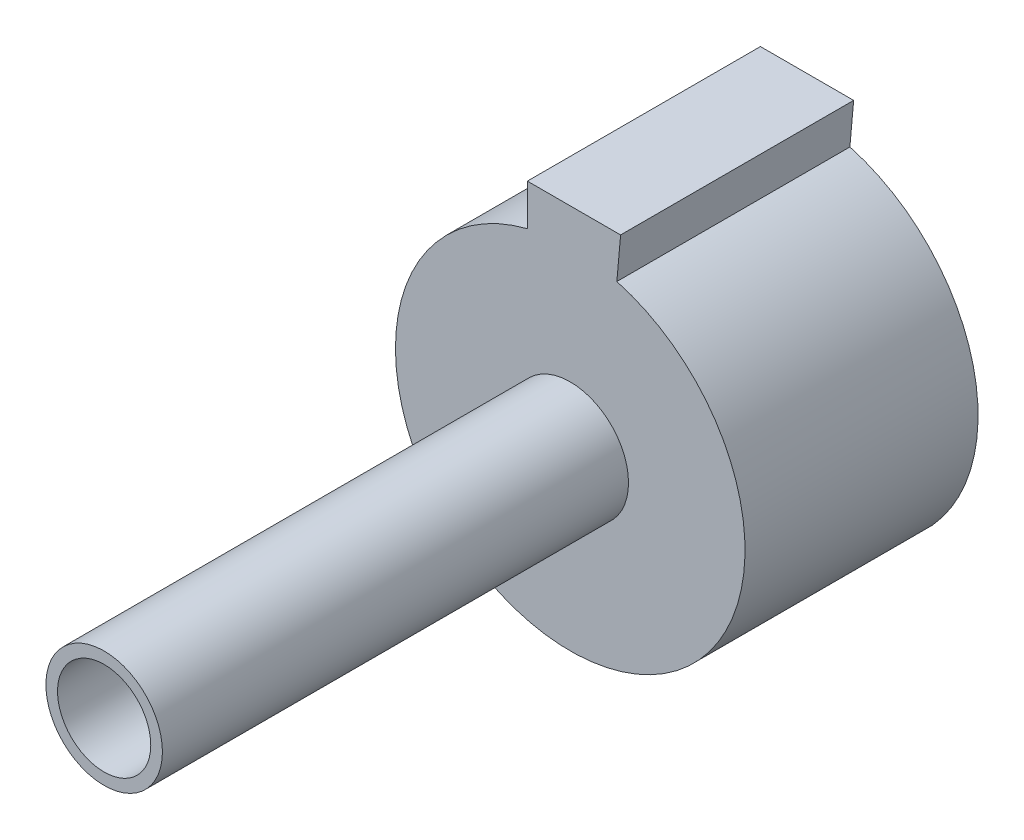
ISO-10303-21;
HEADER;
FILE_DESCRIPTION(('STEP AP214'),'2;1');
FILE_NAME('part.step','',(''),(''),'','','');
FILE_SCHEMA(('AUTOMOTIVE_DESIGN { 1 0 10303 214 1 1 1 1 }'));
ENDSEC;
DATA;
#1=APPLICATION_CONTEXT('core data for automotive mechanical design processes');
#2=APPLICATION_PROTOCOL_DEFINITION('international standard','automotive_design',2000,#1);
#3=PRODUCT_CONTEXT('',#1,'mechanical');
#4=PRODUCT('Part','Part','',(#3));
#5=PRODUCT_RELATED_PRODUCT_CATEGORY('part','',(#4));
#6=PRODUCT_DEFINITION_FORMATION('','',#4);
#7=PRODUCT_DEFINITION_CONTEXT('part definition',#1,'design');
#8=PRODUCT_DEFINITION('design','',#6,#7);
#9=PRODUCT_DEFINITION_SHAPE('','',#8);
#10=(LENGTH_UNIT() NAMED_UNIT(*) SI_UNIT(.MILLI.,.METRE.));
#11=(NAMED_UNIT(*) PLANE_ANGLE_UNIT() SI_UNIT($,.RADIAN.));
#12=(NAMED_UNIT(*) SI_UNIT($,.STERADIAN.) SOLID_ANGLE_UNIT());
#13=UNCERTAINTY_MEASURE_WITH_UNIT(LENGTH_MEASURE(1.E-05),#10,'distance_accuracy_value','');
#14=(GEOMETRIC_REPRESENTATION_CONTEXT(3) GLOBAL_UNCERTAINTY_ASSIGNED_CONTEXT((#13)) GLOBAL_UNIT_ASSIGNED_CONTEXT((#10,
#11,#12)) REPRESENTATION_CONTEXT('',''));
#15=CARTESIAN_POINT('',(0.,0.,0.));
#16=DIRECTION('',(0.,0.,1.));
#17=DIRECTION('',(1.,0.,0.));
#18=AXIS2_PLACEMENT_3D('',#15,#16,#17);
#19=CARTESIAN_POINT('',(4.3213722645746,18.0819289636609,20.));
#20=DIRECTION('',(0.,-1.,0.));
#21=DIRECTION('',(1.,0.,0.));
#22=AXIS2_PLACEMENT_3D('',#19,#20,#21);
#23=PLANE('',#22);
#24=DIRECTION('',(-1.,0.,0.));
#25=VECTOR('',#24,1.);
#26=CARTESIAN_POINT('',(4.3213722645746,18.0819289636609,0.));
#27=LINE('',#26,#25);
#28=CARTESIAN_POINT('',(4.3213722645746,18.0819289636609,0.));
#29=VERTEX_POINT('',#28);
#30=CARTESIAN_POINT('',(-3.6786277354254,18.0819289636609,0.));
#31=VERTEX_POINT('',#30);
#32=EDGE_CURVE('E102',#29,#31,#27,.T.);
#33=ORIENTED_EDGE('',*,*,#32,.T.);
#34=DIRECTION('',(0.,0.,-1.));
#35=VECTOR('',#34,1.);
#36=CARTESIAN_POINT('',(-3.6786277354254,18.0819289636609,20.));
#37=LINE('',#36,#35);
#38=CARTESIAN_POINT('',(-3.6786277354254,18.0819289636609,20.));
#39=VERTEX_POINT('',#38);
#40=EDGE_CURVE('E39',#39,#31,#37,.T.);
#41=ORIENTED_EDGE('',*,*,#40,.F.);
#42=DIRECTION('',(-1.,0.,0.));
#43=VECTOR('',#42,1.);
#44=CARTESIAN_POINT('',(4.3213722645746,18.0819289636609,20.));
#45=LINE('',#44,#43);
#46=CARTESIAN_POINT('',(4.3213722645746,18.0819289636609,20.));
#47=VERTEX_POINT('',#46);
#48=EDGE_CURVE('E89',#47,#39,#45,.T.);
#49=ORIENTED_EDGE('',*,*,#48,.F.);
#50=DIRECTION('',(0.,0.,-1.));
#51=VECTOR('',#50,1.);
#52=CARTESIAN_POINT('',(4.3213722645746,18.0819289636609,20.));
#53=LINE('',#52,#51);
#54=EDGE_CURVE('E98',#47,#29,#53,.T.);
#55=ORIENTED_EDGE('',*,*,#54,.T.);
#56=EDGE_LOOP('',(#33,#41,#49,#55));
#57=FACE_BOUND('',#56,.T.);
#58=ADVANCED_FACE('F36',(#57),#23,.F.);
#59=CARTESIAN_POINT('',(-3.6786277354254,14.5419289636609,20.));
#60=DIRECTION('',(1.,0.,0.));
#61=DIRECTION('',(0.,1.,0.));
#62=AXIS2_PLACEMENT_3D('',#59,#60,#61);
#63=PLANE('',#62);
#64=DIRECTION('',(0.,-1.,0.));
#65=VECTOR('',#64,1.);
#66=CARTESIAN_POINT('',(-3.6786277354254,14.5419289636609,0.));
#67=LINE('',#66,#65);
#68=CARTESIAN_POINT('',(-3.6786277354254,14.5419289636609,0.));
#69=VERTEX_POINT('',#68);
#70=EDGE_CURVE('E94',#31,#69,#67,.T.);
#71=ORIENTED_EDGE('',*,*,#70,.T.);
#72=DIRECTION('',(0.,0.,-1.));
#73=VECTOR('',#72,1.);
#74=CARTESIAN_POINT('',(-3.6786277354254,14.5419289636609,20.));
#75=LINE('',#74,#73);
#76=CARTESIAN_POINT('',(-3.6786277354254,14.5419289636609,20.));
#77=VERTEX_POINT('',#76);
#78=EDGE_CURVE('E92',#77,#69,#75,.T.);
#79=ORIENTED_EDGE('',*,*,#78,.F.);
#80=DIRECTION('',(0.,-1.,0.));
#81=VECTOR('',#80,1.);
#82=CARTESIAN_POINT('',(-3.6786277354254,14.5419289636609,20.));
#83=LINE('',#82,#81);
#84=EDGE_CURVE('E84',#39,#77,#83,.T.);
#85=ORIENTED_EDGE('',*,*,#84,.F.);
#86=ORIENTED_EDGE('',*,*,#40,.T.);
#87=EDGE_LOOP('',(#71,#79,#85,#86));
#88=FACE_BOUND('',#87,.T.);
#89=ADVANCED_FACE('F93',(#88),#63,.F.);
#90=CARTESIAN_POINT('',(0.,0.,20.));
#91=DIRECTION('',(0.,0.,-1.));
#92=DIRECTION('',(-1.,0.,0.));
#93=AXIS2_PLACEMENT_3D('',#90,#91,#92);
#94=CYLINDRICAL_SURFACE('',#93,15.);
#95=CARTESIAN_POINT('',(0.,0.,0.));
#96=DIRECTION('',(0.,0.,1.));
#97=DIRECTION('',(1.,0.,0.));
#98=AXIS2_PLACEMENT_3D('',#95,#96,#97);
#99=CIRCLE('',#98,15.);
#100=CARTESIAN_POINT('',(4.,14.456832294801,0.));
#101=VERTEX_POINT('',#100);
#102=EDGE_CURVE('E70',#69,#101,#99,.T.);
#103=ORIENTED_EDGE('',*,*,#102,.T.);
#104=DIRECTION('',(0.,0.,-1.));
#105=VECTOR('',#104,1.);
#106=CARTESIAN_POINT('',(4.,14.456832294801,20.));
#107=LINE('',#106,#105);
#108=CARTESIAN_POINT('',(4.,14.456832294801,20.));
#109=VERTEX_POINT('',#108);
#110=EDGE_CURVE('E95',#109,#101,#107,.T.);
#111=ORIENTED_EDGE('',*,*,#110,.F.);
#112=CARTESIAN_POINT('',(0.,0.,20.));
#113=DIRECTION('',(0.,0.,1.));
#114=DIRECTION('',(1.,0.,0.));
#115=AXIS2_PLACEMENT_3D('',#112,#113,#114);
#116=CIRCLE('',#115,15.);
#117=EDGE_CURVE('E87',#77,#109,#116,.T.);
#118=ORIENTED_EDGE('',*,*,#117,.F.);
#119=ORIENTED_EDGE('',*,*,#78,.T.);
#120=EDGE_LOOP('',(#103,#111,#118,#119));
#121=FACE_BOUND('',#120,.T.);
#122=ADVANCED_FACE('F96',(#121),#94,.T.);
#123=CARTESIAN_POINT('',(4.,14.456832294801,20.));
#124=DIRECTION('',(-0.996093418579165,0.0883057272393558,0.));
#125=DIRECTION('',(-0.0883057272393558,-0.996093418579165,0.));
#126=AXIS2_PLACEMENT_3D('',#123,#124,#125);
#127=PLANE('',#126);
#128=DIRECTION('',(0.0883057272393558,0.996093418579165,0.));
#129=VECTOR('',#128,1.);
#130=CARTESIAN_POINT('',(4.,14.456832294801,0.));
#131=LINE('',#130,#129);
#132=EDGE_CURVE('E76',#101,#29,#131,.T.);
#133=ORIENTED_EDGE('',*,*,#132,.T.);
#134=ORIENTED_EDGE('',*,*,#54,.F.);
#135=DIRECTION('',(0.0883057272393558,0.996093418579165,0.));
#136=VECTOR('',#135,1.);
#137=CARTESIAN_POINT('',(4.,14.456832294801,20.));
#138=LINE('',#137,#136);
#139=EDGE_CURVE('E53',#109,#47,#138,.T.);
#140=ORIENTED_EDGE('',*,*,#139,.F.);
#141=ORIENTED_EDGE('',*,*,#110,.T.);
#142=EDGE_LOOP('',(#133,#134,#140,#141));
#143=FACE_BOUND('',#142,.T.);
#144=ADVANCED_FACE('F110',(#143),#127,.F.);
#145=CARTESIAN_POINT('',(0.,0.,20.));
#146=DIRECTION('',(0.,0.,1.));
#147=DIRECTION('',(1.,0.,0.));
#148=AXIS2_PLACEMENT_3D('',#145,#146,#147);
#149=PLANE('',#148);
#150=CARTESIAN_POINT('',(0.,0.,20.));
#151=DIRECTION('',(0.,0.,1.));
#152=DIRECTION('',(1.,0.,0.));
#153=AXIS2_PLACEMENT_3D('',#150,#151,#152);
#154=CIRCLE('',#153,5.);
#155=CARTESIAN_POINT('',(5.,0.,20.));
#156=VERTEX_POINT('',#155);
#157=EDGE_CURVE('E11',#156,#156,#154,.T.);
#158=ORIENTED_EDGE('',*,*,#157,.F.);
#159=EDGE_LOOP('',(#158));
#160=FACE_BOUND('',#159,.T.);
#161=ORIENTED_EDGE('',*,*,#48,.T.);
#162=ORIENTED_EDGE('',*,*,#84,.T.);
#163=ORIENTED_EDGE('',*,*,#117,.T.);
#164=ORIENTED_EDGE('',*,*,#139,.T.);
#165=EDGE_LOOP('',(#161,#162,#163,#164));
#166=FACE_BOUND('',#165,.T.);
#167=ADVANCED_FACE('F85',(#160,#166),#149,.T.);
#168=CARTESIAN_POINT('',(0.,0.,0.));
#169=DIRECTION('',(0.,0.,1.));
#170=DIRECTION('',(1.,0.,0.));
#171=AXIS2_PLACEMENT_3D('',#168,#169,#170);
#172=PLANE('',#171);
#173=ORIENTED_EDGE('',*,*,#32,.F.);
#174=ORIENTED_EDGE('',*,*,#132,.F.);
#175=ORIENTED_EDGE('',*,*,#102,.F.);
#176=ORIENTED_EDGE('',*,*,#70,.F.);
#177=EDGE_LOOP('',(#173,#174,#175,#176));
#178=FACE_BOUND('',#177,.T.);
#179=ADVANCED_FACE('F113',(#178),#172,.F.);
#180=CARTESIAN_POINT('',(0.,0.,60.));
#181=DIRECTION('',(0.,0.,-1.));
#182=DIRECTION('',(-1.,0.,0.));
#183=AXIS2_PLACEMENT_3D('',#180,#181,#182);
#184=CYLINDRICAL_SURFACE('',#183,5.);
#185=CARTESIAN_POINT('',(0.,0.,60.));
#186=DIRECTION('',(0.,0.,1.));
#187=DIRECTION('',(1.,0.,0.));
#188=AXIS2_PLACEMENT_3D('',#185,#186,#187);
#189=CIRCLE('',#188,5.);
#190=CARTESIAN_POINT('',(5.,0.,60.));
#191=VERTEX_POINT('',#190);
#192=EDGE_CURVE('E105',#191,#191,#189,.T.);
#193=ORIENTED_EDGE('',*,*,#192,.F.);
#194=EDGE_LOOP('',(#193));
#195=FACE_BOUND('',#194,.T.);
#196=ORIENTED_EDGE('',*,*,#157,.T.);
#197=EDGE_LOOP('',(#196));
#198=FACE_BOUND('',#197,.T.);
#199=ADVANCED_FACE('F136',(#195,#198),#184,.T.);
#200=CARTESIAN_POINT('',(0.,0.,60.));
#201=DIRECTION('',(0.,0.,1.));
#202=DIRECTION('',(1.,0.,0.));
#203=AXIS2_PLACEMENT_3D('',#200,#201,#202);
#204=PLANE('',#203);
#205=CARTESIAN_POINT('',(0.,0.,60.));
#206=DIRECTION('',(0.,0.,1.));
#207=DIRECTION('',(1.,0.,0.));
#208=AXIS2_PLACEMENT_3D('',#205,#206,#207);
#209=CIRCLE('',#208,4.);
#210=CARTESIAN_POINT('',(4.,0.,60.));
#211=VERTEX_POINT('',#210);
#212=EDGE_CURVE('E119',#211,#211,#209,.T.);
#213=ORIENTED_EDGE('',*,*,#212,.F.);
#214=EDGE_LOOP('',(#213));
#215=FACE_BOUND('',#214,.T.);
#216=ORIENTED_EDGE('',*,*,#192,.T.);
#217=EDGE_LOOP('',(#216));
#218=FACE_BOUND('',#217,.T.);
#219=ADVANCED_FACE('F130',(#215,#218),#204,.T.);
#220=CARTESIAN_POINT('',(0.,0.,20.));
#221=DIRECTION('',(0.,0.,1.));
#222=DIRECTION('',(1.,0.,0.));
#223=AXIS2_PLACEMENT_3D('',#220,#221,#222);
#224=CYLINDRICAL_SURFACE('',#223,4.);
#225=CARTESIAN_POINT('',(0.,0.,20.));
#226=DIRECTION('',(0.,0.,1.));
#227=DIRECTION('',(1.,0.,0.));
#228=AXIS2_PLACEMENT_3D('',#225,#226,#227);
#229=CIRCLE('',#228,4.);
#230=CARTESIAN_POINT('',(4.,0.,20.));
#231=VERTEX_POINT('',#230);
#232=EDGE_CURVE('E118',#231,#231,#229,.T.);
#233=ORIENTED_EDGE('',*,*,#232,.F.);
#234=EDGE_LOOP('',(#233));
#235=FACE_BOUND('',#234,.T.);
#236=ORIENTED_EDGE('',*,*,#212,.T.);
#237=EDGE_LOOP('',(#236));
#238=FACE_BOUND('',#237,.T.);
#239=ADVANCED_FACE('F127',(#235,#238),#224,.F.);
#240=CARTESIAN_POINT('',(0.,0.,20.));
#241=DIRECTION('',(0.,0.,1.));
#242=DIRECTION('',(1.,0.,0.));
#243=AXIS2_PLACEMENT_3D('',#240,#241,#242);
#244=PLANE('',#243);
#245=ORIENTED_EDGE('',*,*,#232,.T.);
#246=EDGE_LOOP('',(#245));
#247=FACE_BOUND('',#246,.T.);
#248=ADVANCED_FACE('F125',(#247),#244,.T.);
#249=CLOSED_SHELL('',(#58,#89,#122,#144,#167,#179,#199,#219,#239,#248));
#250=MANIFOLD_SOLID_BREP('B2',#249);
#251=ADVANCED_BREP_SHAPE_REPRESENTATION('',(#18,#250),#14);
#252=SHAPE_DEFINITION_REPRESENTATION(#9,#251);
ENDSEC;
END-ISO-10303-21;
